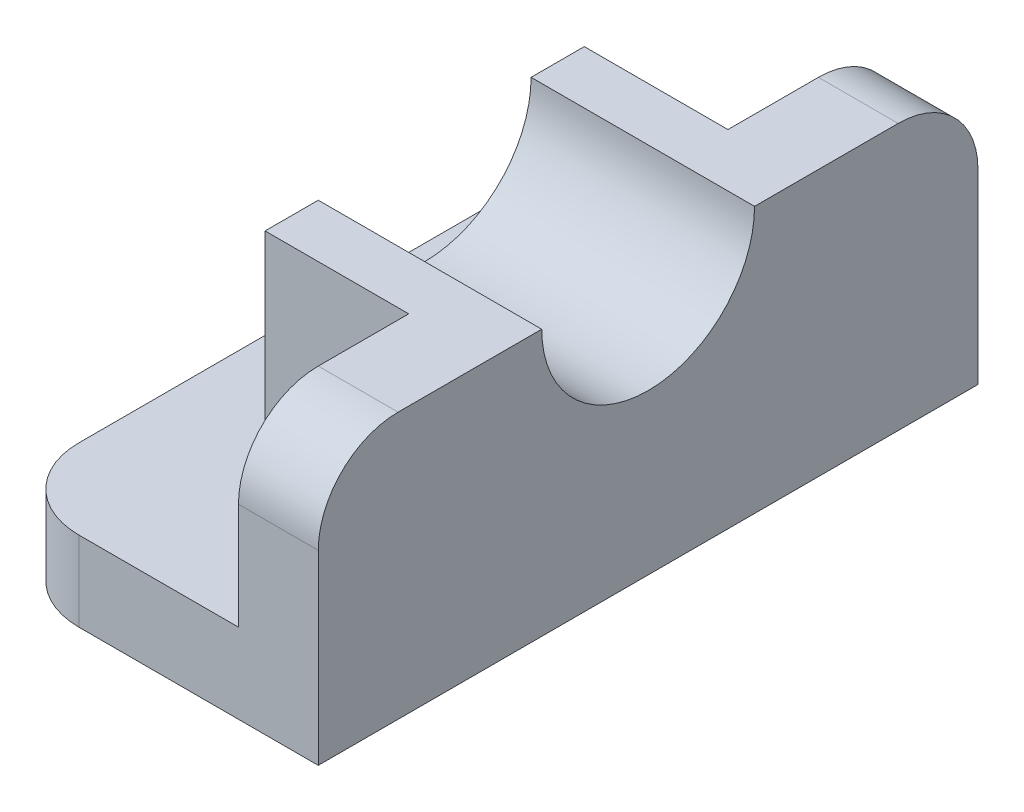
ISO-10303-21;
HEADER;
FILE_DESCRIPTION(('STEP AP214'),'2;1');
FILE_NAME('part.step','',(''),(''),'','','');
FILE_SCHEMA(('AUTOMOTIVE_DESIGN { 1 0 10303 214 1 1 1 1 }'));
ENDSEC;
DATA;
#1=APPLICATION_CONTEXT('core data for automotive mechanical design processes');
#2=APPLICATION_PROTOCOL_DEFINITION('international standard','automotive_design',2000,#1);
#3=PRODUCT_CONTEXT('',#1,'mechanical');
#4=PRODUCT('Part','Part','',(#3));
#5=PRODUCT_RELATED_PRODUCT_CATEGORY('part','',(#4));
#6=PRODUCT_DEFINITION_FORMATION('','',#4);
#7=PRODUCT_DEFINITION_CONTEXT('part definition',#1,'design');
#8=PRODUCT_DEFINITION('design','',#6,#7);
#9=PRODUCT_DEFINITION_SHAPE('','',#8);
#10=(LENGTH_UNIT() NAMED_UNIT(*) SI_UNIT(.MILLI.,.METRE.));
#11=(NAMED_UNIT(*) PLANE_ANGLE_UNIT() SI_UNIT($,.RADIAN.));
#12=(NAMED_UNIT(*) SI_UNIT($,.STERADIAN.) SOLID_ANGLE_UNIT());
#13=UNCERTAINTY_MEASURE_WITH_UNIT(LENGTH_MEASURE(1.E-05),#10,'distance_accuracy_value','');
#14=(GEOMETRIC_REPRESENTATION_CONTEXT(3) GLOBAL_UNCERTAINTY_ASSIGNED_CONTEXT((#13)) GLOBAL_UNIT_ASSIGNED_CONTEXT((#10,
#11,#12)) REPRESENTATION_CONTEXT('',''));
#15=CARTESIAN_POINT('',(0.,0.,0.));
#16=DIRECTION('',(0.,0.,1.));
#17=DIRECTION('',(1.,0.,0.));
#18=AXIS2_PLACEMENT_3D('',#15,#16,#17);
#19=CARTESIAN_POINT('',(60.,50.,124.));
#20=DIRECTION('',(0.,-1.,0.));
#21=DIRECTION('',(0.,0.,-1.));
#22=AXIS2_PLACEMENT_3D('',#19,#20,#21);
#23=PLANE('',#22);
#24=DIRECTION('',(0.,0.,-1.));
#25=VECTOR('',#24,1.);
#26=CARTESIAN_POINT('',(60.,50.,124.));
#27=LINE('',#26,#25);
#28=CARTESIAN_POINT('',(60.,50.,109.));
#29=VERTEX_POINT('',#28);
#30=CARTESIAN_POINT('',(60.,50.,82.));
#31=VERTEX_POINT('',#30);
#32=EDGE_CURVE('E163',#29,#31,#27,.T.);
#33=ORIENTED_EDGE('',*,*,#32,.T.);
#34=DIRECTION('',(-1.,0.,0.));
#35=VECTOR('',#34,1.);
#36=CARTESIAN_POINT('',(79.,50.,82.));
#37=LINE('',#36,#35);
#38=CARTESIAN_POINT('',(18.,50.,82.));
#39=VERTEX_POINT('',#38);
#40=EDGE_CURVE('E152',#31,#39,#37,.T.);
#41=ORIENTED_EDGE('',*,*,#40,.T.);
#42=DIRECTION('',(0.,0.,-1.));
#43=VECTOR('',#42,1.);
#44=CARTESIAN_POINT('',(18.,50.,32.));
#45=LINE('',#44,#43);
#46=CARTESIAN_POINT('',(18.,50.,92.));
#47=VERTEX_POINT('',#46);
#48=EDGE_CURVE('E161',#47,#39,#45,.T.);
#49=ORIENTED_EDGE('',*,*,#48,.F.);
#50=DIRECTION('',(1.,0.,0.));
#51=VECTOR('',#50,1.);
#52=CARTESIAN_POINT('',(18.,50.,92.));
#53=LINE('',#52,#51);
#54=CARTESIAN_POINT('',(45.,50.,92.));
#55=VERTEX_POINT('',#54);
#56=EDGE_CURVE('E178',#47,#55,#53,.T.);
#57=ORIENTED_EDGE('',*,*,#56,.T.);
#58=DIRECTION('',(0.,0.,-1.));
#59=VECTOR('',#58,1.);
#60=CARTESIAN_POINT('',(45.,50.,124.));
#61=LINE('',#60,#59);
#62=CARTESIAN_POINT('',(45.,50.,109.));
#63=VERTEX_POINT('',#62);
#64=EDGE_CURVE('E235',#63,#55,#61,.T.);
#65=ORIENTED_EDGE('',*,*,#64,.F.);
#66=DIRECTION('',(-1.,0.,0.));
#67=VECTOR('',#66,1.);
#68=CARTESIAN_POINT('',(60.,50.,109.));
#69=LINE('',#68,#67);
#70=EDGE_CURVE('E268',#63,#29,#69,.F.);
#71=ORIENTED_EDGE('',*,*,#70,.T.);
#72=EDGE_LOOP('',(#33,#41,#49,#57,#65,#71));
#73=FACE_BOUND('',#72,.T.);
#74=ADVANCED_FACE('F39',(#73),#23,.F.);
#75=CARTESIAN_POINT('',(45.,50.,124.));
#76=DIRECTION('',(1.,0.,0.));
#77=DIRECTION('',(0.,1.,0.));
#78=AXIS2_PLACEMENT_3D('',#75,#76,#77);
#79=PLANE('',#78);
#80=DIRECTION('',(0.,-1.,0.));
#81=VECTOR('',#80,1.);
#82=CARTESIAN_POINT('',(45.,50.,32.));
#83=LINE('',#82,#81);
#84=CARTESIAN_POINT('',(45.,50.,32.));
#85=VERTEX_POINT('',#84);
#86=CARTESIAN_POINT('',(45.,15.,32.));
#87=VERTEX_POINT('',#86);
#88=EDGE_CURVE('E165',#85,#87,#83,.T.);
#89=ORIENTED_EDGE('',*,*,#88,.F.);
#90=CARTESIAN_POINT('',(45.,50.,15.));
#91=VERTEX_POINT('',#90);
#92=EDGE_CURVE('E234',#85,#91,#61,.T.);
#93=ORIENTED_EDGE('',*,*,#92,.T.);
#94=CARTESIAN_POINT('',(45.,35.,15.));
#95=DIRECTION('',(1.,0.,0.));
#96=DIRECTION('',(0.,1.,0.));
#97=AXIS2_PLACEMENT_3D('',#94,#95,#96);
#98=CIRCLE('',#97,15.);
#99=CARTESIAN_POINT('',(45.,35.,0.));
#100=VERTEX_POINT('',#99);
#101=EDGE_CURVE('E258',#91,#100,#98,.F.);
#102=ORIENTED_EDGE('',*,*,#101,.T.);
#103=DIRECTION('',(0.,-1.,0.));
#104=VECTOR('',#103,1.);
#105=CARTESIAN_POINT('',(45.,50.,0.));
#106=LINE('',#105,#104);
#107=CARTESIAN_POINT('',(45.,15.,0.));
#108=VERTEX_POINT('',#107);
#109=EDGE_CURVE('E219',#100,#108,#106,.T.);
#110=ORIENTED_EDGE('',*,*,#109,.T.);
#111=DIRECTION('',(0.,0.,-1.));
#112=VECTOR('',#111,1.);
#113=CARTESIAN_POINT('',(45.,15.,124.));
#114=LINE('',#113,#112);
#115=EDGE_CURVE('E229',#87,#108,#114,.T.);
#116=ORIENTED_EDGE('',*,*,#115,.F.);
#117=EDGE_LOOP('',(#89,#93,#102,#110,#116));
#118=FACE_BOUND('',#117,.T.);
#119=ADVANCED_FACE('F360',(#118),#79,.F.);
#120=DIRECTION('',(0.,1.,0.));
#121=VECTOR('',#120,1.);
#122=CARTESIAN_POINT('',(45.,50.,92.));
#123=LINE('',#122,#121);
#124=CARTESIAN_POINT('',(45.,15.,92.));
#125=VERTEX_POINT('',#124);
#126=EDGE_CURVE('E185',#125,#55,#123,.T.);
#127=ORIENTED_EDGE('',*,*,#126,.F.);
#128=CARTESIAN_POINT('',(45.,15.,124.));
#129=VERTEX_POINT('',#128);
#130=EDGE_CURVE('E230',#129,#125,#114,.T.);
#131=ORIENTED_EDGE('',*,*,#130,.F.);
#132=DIRECTION('',(0.,-1.,0.));
#133=VECTOR('',#132,1.);
#134=CARTESIAN_POINT('',(45.,50.,124.));
#135=LINE('',#134,#133);
#136=CARTESIAN_POINT('',(45.,35.,124.));
#137=VERTEX_POINT('',#136);
#138=EDGE_CURVE('E205',#137,#129,#135,.T.);
#139=ORIENTED_EDGE('',*,*,#138,.F.);
#140=CARTESIAN_POINT('',(45.,35.,109.));
#141=DIRECTION('',(1.,0.,0.));
#142=DIRECTION('',(0.,1.,0.));
#143=AXIS2_PLACEMENT_3D('',#140,#141,#142);
#144=CIRCLE('',#143,15.);
#145=EDGE_CURVE('E261',#137,#63,#144,.F.);
#146=ORIENTED_EDGE('',*,*,#145,.T.);
#147=ORIENTED_EDGE('',*,*,#64,.T.);
#148=EDGE_LOOP('',(#127,#131,#139,#146,#147));
#149=FACE_BOUND('',#148,.T.);
#150=ADVANCED_FACE('F336',(#149),#79,.F.);
#151=CARTESIAN_POINT('',(0.,15.,124.));
#152=DIRECTION('',(0.,-1.,0.));
#153=DIRECTION('',(0.,0.,-1.));
#154=AXIS2_PLACEMENT_3D('',#151,#152,#153);
#155=PLANE('',#154);
#156=DIRECTION('',(1.,0.,0.));
#157=VECTOR('',#156,1.);
#158=CARTESIAN_POINT('',(18.,15.,32.));
#159=LINE('',#158,#157);
#160=CARTESIAN_POINT('',(18.,15.,32.));
#161=VERTEX_POINT('',#160);
#162=EDGE_CURVE('E62',#161,#87,#159,.T.);
#163=ORIENTED_EDGE('',*,*,#162,.T.);
#164=ORIENTED_EDGE('',*,*,#115,.T.);
#165=DIRECTION('',(-1.,0.,0.));
#166=VECTOR('',#165,1.);
#167=CARTESIAN_POINT('',(0.,15.,0.));
#168=LINE('',#167,#166);
#169=CARTESIAN_POINT('',(15.,15.,0.));
#170=VERTEX_POINT('',#169);
#171=EDGE_CURVE('E201',#108,#170,#168,.T.);
#172=ORIENTED_EDGE('',*,*,#171,.T.);
#173=CARTESIAN_POINT('',(15.,15.,15.));
#174=DIRECTION('',(0.,-1.,0.));
#175=DIRECTION('',(0.,0.,-1.));
#176=AXIS2_PLACEMENT_3D('',#173,#174,#175);
#177=CIRCLE('',#176,15.);
#178=CARTESIAN_POINT('',(0.,15.,15.));
#179=VERTEX_POINT('',#178);
#180=EDGE_CURVE('E291',#170,#179,#177,.F.);
#181=ORIENTED_EDGE('',*,*,#180,.T.);
#182=DIRECTION('',(0.,0.,-1.));
#183=VECTOR('',#182,1.);
#184=CARTESIAN_POINT('',(0.,15.,124.));
#185=LINE('',#184,#183);
#186=CARTESIAN_POINT('',(0.,15.,109.));
#187=VERTEX_POINT('',#186);
#188=EDGE_CURVE('E212',#187,#179,#185,.T.);
#189=ORIENTED_EDGE('',*,*,#188,.F.);
#190=CARTESIAN_POINT('',(15.,15.,109.));
#191=DIRECTION('',(0.,-1.,0.));
#192=DIRECTION('',(0.,0.,-1.));
#193=AXIS2_PLACEMENT_3D('',#190,#191,#192);
#194=CIRCLE('',#193,15.);
#195=CARTESIAN_POINT('',(15.,15.,124.));
#196=VERTEX_POINT('',#195);
#197=EDGE_CURVE('E294',#187,#196,#194,.F.);
#198=ORIENTED_EDGE('',*,*,#197,.T.);
#199=DIRECTION('',(-1.,0.,0.));
#200=VECTOR('',#199,1.);
#201=CARTESIAN_POINT('',(0.,15.,124.));
#202=LINE('',#201,#200);
#203=EDGE_CURVE('E208',#129,#196,#202,.T.);
#204=ORIENTED_EDGE('',*,*,#203,.F.);
#205=ORIENTED_EDGE('',*,*,#130,.T.);
#206=DIRECTION('',(1.,0.,0.));
#207=VECTOR('',#206,1.);
#208=CARTESIAN_POINT('',(18.,15.,92.));
#209=LINE('',#208,#207);
#210=CARTESIAN_POINT('',(18.,15.,92.));
#211=VERTEX_POINT('',#210);
#212=EDGE_CURVE('E191',#211,#125,#209,.T.);
#213=ORIENTED_EDGE('',*,*,#212,.F.);
#214=DIRECTION('',(0.,0.,1.));
#215=VECTOR('',#214,1.);
#216=CARTESIAN_POINT('',(18.,15.,32.));
#217=LINE('',#216,#215);
#218=EDGE_CURVE('E355',#161,#211,#217,.T.);
#219=ORIENTED_EDGE('',*,*,#218,.F.);
#220=EDGE_LOOP('',(#163,#164,#172,#181,#189,#198,#204,#205,#213,#219));
#221=FACE_BOUND('',#220,.T.);
#222=ADVANCED_FACE('F310',(#221),#155,.F.);
#223=CARTESIAN_POINT('',(0.,0.,124.));
#224=DIRECTION('',(1.,0.,0.));
#225=DIRECTION('',(0.,0.,-1.));
#226=AXIS2_PLACEMENT_3D('',#223,#224,#225);
#227=PLANE('',#226);
#228=DIRECTION('',(0.,0.,-1.));
#229=VECTOR('',#228,1.);
#230=CARTESIAN_POINT('',(0.,0.,124.));
#231=LINE('',#230,#229);
#232=CARTESIAN_POINT('',(0.,0.,109.));
#233=VERTEX_POINT('',#232);
#234=CARTESIAN_POINT('',(0.,0.,15.));
#235=VERTEX_POINT('',#234);
#236=EDGE_CURVE('E246',#233,#235,#231,.T.);
#237=ORIENTED_EDGE('',*,*,#236,.F.);
#238=DIRECTION('',(0.,-1.,0.));
#239=VECTOR('',#238,1.);
#240=CARTESIAN_POINT('',(0.,0.,109.));
#241=LINE('',#240,#239);
#242=EDGE_CURVE('E288',#233,#187,#241,.F.);
#243=ORIENTED_EDGE('',*,*,#242,.T.);
#244=ORIENTED_EDGE('',*,*,#188,.T.);
#245=DIRECTION('',(0.,-1.,0.));
#246=VECTOR('',#245,1.);
#247=CARTESIAN_POINT('',(0.,0.,15.));
#248=LINE('',#247,#246);
#249=EDGE_CURVE('E284',#179,#235,#248,.T.);
#250=ORIENTED_EDGE('',*,*,#249,.T.);
#251=EDGE_LOOP('',(#237,#243,#244,#250));
#252=FACE_BOUND('',#251,.T.);
#253=ADVANCED_FACE('F317',(#252),#227,.F.);
#254=CARTESIAN_POINT('',(0.,0.,124.));
#255=DIRECTION('',(0.,1.,0.));
#256=DIRECTION('',(0.,0.,1.));
#257=AXIS2_PLACEMENT_3D('',#254,#255,#256);
#258=PLANE('',#257);
#259=DIRECTION('',(1.,0.,0.));
#260=VECTOR('',#259,1.);
#261=CARTESIAN_POINT('',(0.,0.,124.));
#262=LINE('',#261,#260);
#263=CARTESIAN_POINT('',(15.,0.,124.));
#264=VERTEX_POINT('',#263);
#265=CARTESIAN_POINT('',(60.,0.,124.));
#266=VERTEX_POINT('',#265);
#267=EDGE_CURVE('E197',#264,#266,#262,.T.);
#268=ORIENTED_EDGE('',*,*,#267,.F.);
#269=CARTESIAN_POINT('',(15.,0.,109.));
#270=DIRECTION('',(0.,1.,0.));
#271=DIRECTION('',(0.,0.,1.));
#272=AXIS2_PLACEMENT_3D('',#269,#270,#271);
#273=CIRCLE('',#272,15.);
#274=EDGE_CURVE('E281',#264,#233,#273,.F.);
#275=ORIENTED_EDGE('',*,*,#274,.T.);
#276=ORIENTED_EDGE('',*,*,#236,.T.);
#277=CARTESIAN_POINT('',(15.,0.,15.));
#278=DIRECTION('',(0.,1.,0.));
#279=DIRECTION('',(0.,0.,1.));
#280=AXIS2_PLACEMENT_3D('',#277,#278,#279);
#281=CIRCLE('',#280,15.);
#282=CARTESIAN_POINT('',(15.,0.,0.));
#283=VERTEX_POINT('',#282);
#284=EDGE_CURVE('E278',#235,#283,#281,.F.);
#285=ORIENTED_EDGE('',*,*,#284,.T.);
#286=DIRECTION('',(1.,0.,0.));
#287=VECTOR('',#286,1.);
#288=CARTESIAN_POINT('',(0.,0.,0.));
#289=LINE('',#288,#287);
#290=CARTESIAN_POINT('',(60.,0.,0.));
#291=VERTEX_POINT('',#290);
#292=EDGE_CURVE('E196',#283,#291,#289,.T.);
#293=ORIENTED_EDGE('',*,*,#292,.T.);
#294=DIRECTION('',(0.,0.,-1.));
#295=VECTOR('',#294,1.);
#296=CARTESIAN_POINT('',(60.,0.,124.));
#297=LINE('',#296,#295);
#298=EDGE_CURVE('E242',#266,#291,#297,.T.);
#299=ORIENTED_EDGE('',*,*,#298,.F.);
#300=EDGE_LOOP('',(#268,#275,#276,#285,#293,#299));
#301=FACE_BOUND('',#300,.T.);
#302=ADVANCED_FACE('F321',(#301),#258,.F.);
#303=CARTESIAN_POINT('',(60.,0.,124.));
#304=DIRECTION('',(-1.,0.,0.));
#305=DIRECTION('',(0.,0.,1.));
#306=AXIS2_PLACEMENT_3D('',#303,#304,#305);
#307=PLANE('',#306);
#308=CARTESIAN_POINT('',(60.,50.,42.));
#309=VERTEX_POINT('',#308);
#310=CARTESIAN_POINT('',(60.,50.,15.));
#311=VERTEX_POINT('',#310);
#312=EDGE_CURVE('E239',#309,#311,#27,.T.);
#313=ORIENTED_EDGE('',*,*,#312,.F.);
#314=CARTESIAN_POINT('',(60.,50.,62.));
#315=DIRECTION('',(-1.,0.,0.));
#316=DIRECTION('',(0.,0.,1.));
#317=AXIS2_PLACEMENT_3D('',#314,#315,#316);
#318=CIRCLE('',#317,20.);
#319=EDGE_CURVE('E166',#309,#31,#318,.T.);
#320=ORIENTED_EDGE('',*,*,#319,.T.);
#321=ORIENTED_EDGE('',*,*,#32,.F.);
#322=CARTESIAN_POINT('',(60.,35.,109.));
#323=DIRECTION('',(-1.,0.,0.));
#324=DIRECTION('',(0.,0.,1.));
#325=AXIS2_PLACEMENT_3D('',#322,#323,#324);
#326=CIRCLE('',#325,15.);
#327=CARTESIAN_POINT('',(60.,35.,124.));
#328=VERTEX_POINT('',#327);
#329=EDGE_CURVE('E275',#29,#328,#326,.F.);
#330=ORIENTED_EDGE('',*,*,#329,.T.);
#331=DIRECTION('',(0.,1.,0.));
#332=VECTOR('',#331,1.);
#333=CARTESIAN_POINT('',(60.,0.,124.));
#334=LINE('',#333,#332);
#335=EDGE_CURVE('E200',#266,#328,#334,.T.);
#336=ORIENTED_EDGE('',*,*,#335,.F.);
#337=ORIENTED_EDGE('',*,*,#298,.T.);
#338=DIRECTION('',(0.,1.,0.));
#339=VECTOR('',#338,1.);
#340=CARTESIAN_POINT('',(60.,0.,0.));
#341=LINE('',#340,#339);
#342=CARTESIAN_POINT('',(60.,35.,0.));
#343=VERTEX_POINT('',#342);
#344=EDGE_CURVE('E215',#291,#343,#341,.T.);
#345=ORIENTED_EDGE('',*,*,#344,.T.);
#346=CARTESIAN_POINT('',(60.,35.,15.));
#347=DIRECTION('',(-1.,0.,0.));
#348=DIRECTION('',(0.,0.,1.));
#349=AXIS2_PLACEMENT_3D('',#346,#347,#348);
#350=CIRCLE('',#349,15.);
#351=EDGE_CURVE('E271',#343,#311,#350,.F.);
#352=ORIENTED_EDGE('',*,*,#351,.T.);
#353=EDGE_LOOP('',(#313,#320,#321,#330,#336,#337,#345,#352));
#354=FACE_BOUND('',#353,.T.);
#355=ADVANCED_FACE('F348',(#354),#307,.F.);
#356=CARTESIAN_POINT('',(18.,50.,42.));
#357=VERTEX_POINT('',#356);
#358=CARTESIAN_POINT('',(18.,50.,32.));
#359=VERTEX_POINT('',#358);
#360=EDGE_CURVE('E174',#357,#359,#45,.T.);
#361=ORIENTED_EDGE('',*,*,#360,.F.);
#362=DIRECTION('',(-1.,0.,0.));
#363=VECTOR('',#362,1.);
#364=CARTESIAN_POINT('',(79.,50.,42.));
#365=LINE('',#364,#363);
#366=EDGE_CURVE('E54',#357,#309,#365,.F.);
#367=ORIENTED_EDGE('',*,*,#366,.T.);
#368=ORIENTED_EDGE('',*,*,#312,.T.);
#369=DIRECTION('',(-1.,0.,0.));
#370=VECTOR('',#369,1.);
#371=CARTESIAN_POINT('',(45.,50.,15.));
#372=LINE('',#371,#370);
#373=EDGE_CURVE('E264',#311,#91,#372,.T.);
#374=ORIENTED_EDGE('',*,*,#373,.T.);
#375=ORIENTED_EDGE('',*,*,#92,.F.);
#376=DIRECTION('',(1.,0.,0.));
#377=VECTOR('',#376,1.);
#378=CARTESIAN_POINT('',(18.,50.,32.));
#379=LINE('',#378,#377);
#380=EDGE_CURVE('E173',#359,#85,#379,.T.);
#381=ORIENTED_EDGE('',*,*,#380,.F.);
#382=EDGE_LOOP('',(#361,#367,#368,#374,#375,#381));
#383=FACE_BOUND('',#382,.T.);
#384=ADVANCED_FACE('F366',(#383),#23,.F.);
#385=CARTESIAN_POINT('',(0.,0.,124.));
#386=DIRECTION('',(0.,0.,-1.));
#387=DIRECTION('',(-1.,0.,0.));
#388=AXIS2_PLACEMENT_3D('',#385,#386,#387);
#389=PLANE('',#388);
#390=ORIENTED_EDGE('',*,*,#335,.T.);
#391=DIRECTION('',(-1.,0.,0.));
#392=VECTOR('',#391,1.);
#393=CARTESIAN_POINT('',(0.,35.,124.));
#394=LINE('',#393,#392);
#395=EDGE_CURVE('E254',#328,#137,#394,.T.);
#396=ORIENTED_EDGE('',*,*,#395,.T.);
#397=ORIENTED_EDGE('',*,*,#138,.T.);
#398=ORIENTED_EDGE('',*,*,#203,.T.);
#399=DIRECTION('',(0.,-1.,0.));
#400=VECTOR('',#399,1.);
#401=CARTESIAN_POINT('',(15.,0.,124.));
#402=LINE('',#401,#400);
#403=EDGE_CURVE('E250',#196,#264,#402,.T.);
#404=ORIENTED_EDGE('',*,*,#403,.T.);
#405=ORIENTED_EDGE('',*,*,#267,.T.);
#406=EDGE_LOOP('',(#390,#396,#397,#398,#404,#405));
#407=FACE_BOUND('',#406,.T.);
#408=ADVANCED_FACE('F328',(#407),#389,.F.);
#409=CARTESIAN_POINT('',(0.,0.,0.));
#410=DIRECTION('',(0.,0.,-1.));
#411=DIRECTION('',(-1.,0.,0.));
#412=AXIS2_PLACEMENT_3D('',#409,#410,#411);
#413=PLANE('',#412);
#414=ORIENTED_EDGE('',*,*,#292,.F.);
#415=DIRECTION('',(0.,-1.,0.));
#416=VECTOR('',#415,1.);
#417=CARTESIAN_POINT('',(15.,15.,0.));
#418=LINE('',#417,#416);
#419=EDGE_CURVE('E48',#283,#170,#418,.F.);
#420=ORIENTED_EDGE('',*,*,#419,.T.);
#421=ORIENTED_EDGE('',*,*,#171,.F.);
#422=ORIENTED_EDGE('',*,*,#109,.F.);
#423=DIRECTION('',(-1.,0.,0.));
#424=VECTOR('',#423,1.);
#425=CARTESIAN_POINT('',(60.,35.,0.));
#426=LINE('',#425,#424);
#427=EDGE_CURVE('E297',#100,#343,#426,.F.);
#428=ORIENTED_EDGE('',*,*,#427,.T.);
#429=ORIENTED_EDGE('',*,*,#344,.F.);
#430=EDGE_LOOP('',(#414,#420,#421,#422,#428,#429));
#431=FACE_BOUND('',#430,.T.);
#432=ADVANCED_FACE('F304',(#431),#413,.T.);
#433=CARTESIAN_POINT('',(0.,35.,109.));
#434=DIRECTION('',(-1.,0.,0.));
#435=DIRECTION('',(0.,0.,1.));
#436=AXIS2_PLACEMENT_3D('',#433,#434,#435);
#437=CYLINDRICAL_SURFACE('',#436,15.);
#438=ORIENTED_EDGE('',*,*,#329,.F.);
#439=ORIENTED_EDGE('',*,*,#70,.F.);
#440=ORIENTED_EDGE('',*,*,#145,.F.);
#441=ORIENTED_EDGE('',*,*,#395,.F.);
#442=EDGE_LOOP('',(#438,#439,#440,#441));
#443=FACE_BOUND('',#442,.T.);
#444=ADVANCED_FACE('F343',(#443),#437,.T.);
#445=CARTESIAN_POINT('',(15.,0.,109.));
#446=DIRECTION('',(0.,-1.,0.));
#447=DIRECTION('',(0.,0.,-1.));
#448=AXIS2_PLACEMENT_3D('',#445,#446,#447);
#449=CYLINDRICAL_SURFACE('',#448,15.);
#450=ORIENTED_EDGE('',*,*,#197,.F.);
#451=ORIENTED_EDGE('',*,*,#242,.F.);
#452=ORIENTED_EDGE('',*,*,#274,.F.);
#453=ORIENTED_EDGE('',*,*,#403,.F.);
#454=EDGE_LOOP('',(#450,#451,#452,#453));
#455=FACE_BOUND('',#454,.T.);
#456=ADVANCED_FACE('F326',(#455),#449,.T.);
#457=CARTESIAN_POINT('',(15.,0.,15.));
#458=DIRECTION('',(0.,1.,0.));
#459=DIRECTION('',(0.,0.,1.));
#460=AXIS2_PLACEMENT_3D('',#457,#458,#459);
#461=CYLINDRICAL_SURFACE('',#460,15.);
#462=ORIENTED_EDGE('',*,*,#180,.F.);
#463=ORIENTED_EDGE('',*,*,#419,.F.);
#464=ORIENTED_EDGE('',*,*,#284,.F.);
#465=ORIENTED_EDGE('',*,*,#249,.F.);
#466=EDGE_LOOP('',(#462,#463,#464,#465));
#467=FACE_BOUND('',#466,.T.);
#468=ADVANCED_FACE('F314',(#467),#461,.T.);
#469=CARTESIAN_POINT('',(60.,35.,15.));
#470=DIRECTION('',(1.,0.,0.));
#471=DIRECTION('',(0.,0.,-1.));
#472=AXIS2_PLACEMENT_3D('',#469,#470,#471);
#473=CYLINDRICAL_SURFACE('',#472,15.);
#474=ORIENTED_EDGE('',*,*,#351,.F.);
#475=ORIENTED_EDGE('',*,*,#427,.F.);
#476=ORIENTED_EDGE('',*,*,#101,.F.);
#477=ORIENTED_EDGE('',*,*,#373,.F.);
#478=EDGE_LOOP('',(#474,#475,#476,#477));
#479=FACE_BOUND('',#478,.T.);
#480=ADVANCED_FACE('F41',(#479),#473,.T.);
#481=CARTESIAN_POINT('',(18.,50.,32.));
#482=DIRECTION('',(0.,0.,1.));
#483=DIRECTION('',(0.,-1.,0.));
#484=AXIS2_PLACEMENT_3D('',#481,#482,#483);
#485=PLANE('',#484);
#486=ORIENTED_EDGE('',*,*,#88,.T.);
#487=ORIENTED_EDGE('',*,*,#162,.F.);
#488=DIRECTION('',(0.,-1.,0.));
#489=VECTOR('',#488,1.);
#490=CARTESIAN_POINT('',(18.,50.,32.));
#491=LINE('',#490,#489);
#492=EDGE_CURVE('E187',#359,#161,#491,.T.);
#493=ORIENTED_EDGE('',*,*,#492,.F.);
#494=ORIENTED_EDGE('',*,*,#380,.T.);
#495=EDGE_LOOP('',(#486,#487,#493,#494));
#496=FACE_BOUND('',#495,.T.);
#497=ADVANCED_FACE('F373',(#496),#485,.F.);
#498=CARTESIAN_POINT('',(18.,50.,92.));
#499=DIRECTION('',(0.,0.,-1.));
#500=DIRECTION('',(-1.,0.,0.));
#501=AXIS2_PLACEMENT_3D('',#498,#499,#500);
#502=PLANE('',#501);
#503=ORIENTED_EDGE('',*,*,#126,.T.);
#504=ORIENTED_EDGE('',*,*,#56,.F.);
#505=DIRECTION('',(0.,1.,0.));
#506=VECTOR('',#505,1.);
#507=CARTESIAN_POINT('',(18.,50.,92.));
#508=LINE('',#507,#506);
#509=EDGE_CURVE('E170',#211,#47,#508,.T.);
#510=ORIENTED_EDGE('',*,*,#509,.F.);
#511=ORIENTED_EDGE('',*,*,#212,.T.);
#512=EDGE_LOOP('',(#503,#504,#510,#511));
#513=FACE_BOUND('',#512,.T.);
#514=ADVANCED_FACE('F339',(#513),#502,.F.);
#515=CARTESIAN_POINT('',(18.,0.,0.));
#516=DIRECTION('',(-1.,0.,0.));
#517=DIRECTION('',(0.,-1.,0.));
#518=AXIS2_PLACEMENT_3D('',#515,#516,#517);
#519=PLANE('',#518);
#520=CARTESIAN_POINT('',(18.,50.,62.));
#521=DIRECTION('',(-1.,0.,0.));
#522=DIRECTION('',(0.,-1.,0.));
#523=AXIS2_PLACEMENT_3D('',#520,#521,#522);
#524=CIRCLE('',#523,20.);
#525=EDGE_CURVE('E11',#357,#39,#524,.T.);
#526=ORIENTED_EDGE('',*,*,#525,.F.);
#527=ORIENTED_EDGE('',*,*,#360,.T.);
#528=ORIENTED_EDGE('',*,*,#492,.T.);
#529=ORIENTED_EDGE('',*,*,#218,.T.);
#530=ORIENTED_EDGE('',*,*,#509,.T.);
#531=ORIENTED_EDGE('',*,*,#48,.T.);
#532=EDGE_LOOP('',(#526,#527,#528,#529,#530,#531));
#533=FACE_BOUND('',#532,.T.);
#534=ADVANCED_FACE('F168',(#533),#519,.T.);
#535=CARTESIAN_POINT('',(79.,50.,62.));
#536=DIRECTION('',(-1.,0.,0.));
#537=DIRECTION('',(0.,-1.,0.));
#538=AXIS2_PLACEMENT_3D('',#535,#536,#537);
#539=CYLINDRICAL_SURFACE('',#538,20.);
#540=ORIENTED_EDGE('',*,*,#319,.F.);
#541=ORIENTED_EDGE('',*,*,#366,.F.);
#542=ORIENTED_EDGE('',*,*,#525,.T.);
#543=ORIENTED_EDGE('',*,*,#40,.F.);
#544=EDGE_LOOP('',(#540,#541,#542,#543));
#545=FACE_BOUND('',#544,.T.);
#546=ADVANCED_FACE('F151',(#545),#539,.F.);
#547=CLOSED_SHELL('',(#74,#119,#150,#222,#253,#302,#355,#384,#408,#432,#444,#456,#468,#480,#497,
#514,#534,#546));
#548=MANIFOLD_SOLID_BREP('B2',#547);
#549=ADVANCED_BREP_SHAPE_REPRESENTATION('',(#18,#548),#14);
#550=SHAPE_DEFINITION_REPRESENTATION(#9,#549);
ENDSEC;
END-ISO-10303-21;
